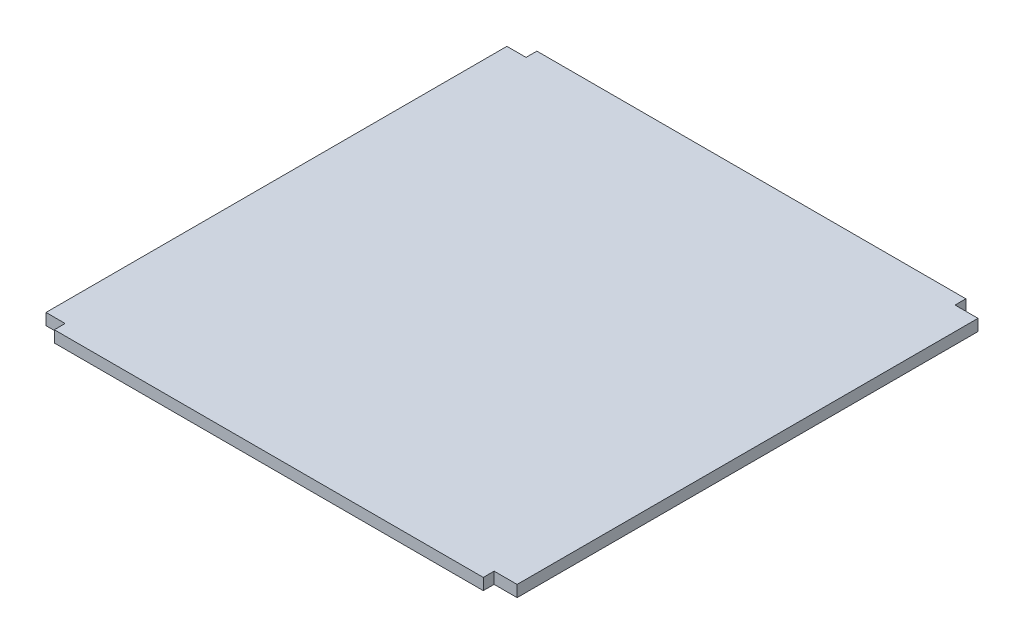
ISO-10303-21;
HEADER;
FILE_DESCRIPTION(('STEP AP214'),'2;1');
FILE_NAME('part.step','',(''),(''),'','','');
FILE_SCHEMA(('AUTOMOTIVE_DESIGN { 1 0 10303 214 1 1 1 1 }'));
ENDSEC;
DATA;
#1=APPLICATION_CONTEXT('core data for automotive mechanical design processes');
#2=APPLICATION_PROTOCOL_DEFINITION('international standard','automotive_design',2000,#1);
#3=PRODUCT_CONTEXT('',#1,'mechanical');
#4=PRODUCT('Part','Part','',(#3));
#5=PRODUCT_RELATED_PRODUCT_CATEGORY('part','',(#4));
#6=PRODUCT_DEFINITION_FORMATION('','',#4);
#7=PRODUCT_DEFINITION_CONTEXT('part definition',#1,'design');
#8=PRODUCT_DEFINITION('design','',#6,#7);
#9=PRODUCT_DEFINITION_SHAPE('','',#8);
#10=(LENGTH_UNIT() NAMED_UNIT(*) SI_UNIT(.MILLI.,.METRE.));
#11=(NAMED_UNIT(*) PLANE_ANGLE_UNIT() SI_UNIT($,.RADIAN.));
#12=(NAMED_UNIT(*) SI_UNIT($,.STERADIAN.) SOLID_ANGLE_UNIT());
#13=UNCERTAINTY_MEASURE_WITH_UNIT(LENGTH_MEASURE(1.E-05),#10,'distance_accuracy_value','');
#14=(GEOMETRIC_REPRESENTATION_CONTEXT(3) GLOBAL_UNCERTAINTY_ASSIGNED_CONTEXT((#13)) GLOBAL_UNIT_ASSIGNED_CONTEXT((#10,
#11,#12)) REPRESENTATION_CONTEXT('',''));
#15=CARTESIAN_POINT('',(0.,0.,0.));
#16=DIRECTION('',(0.,0.,1.));
#17=DIRECTION('',(1.,0.,0.));
#18=AXIS2_PLACEMENT_3D('',#15,#16,#17);
#19=CARTESIAN_POINT('',(2.5,1.5,-1.415));
#20=DIRECTION('',(0.,0.,-1.));
#21=DIRECTION('',(-1.,0.,0.));
#22=AXIS2_PLACEMENT_3D('',#19,#20,#21);
#23=PLANE('',#22);
#24=DIRECTION('',(1.,0.,0.));
#25=VECTOR('',#24,1.);
#26=CARTESIAN_POINT('',(2.5,0.,-1.415));
#27=LINE('',#26,#25);
#28=CARTESIAN_POINT('',(0.,0.,-1.415));
#29=VERTEX_POINT('',#28);
#30=CARTESIAN_POINT('',(2.5,0.,-1.415));
#31=VERTEX_POINT('',#30);
#32=EDGE_CURVE('E170',#29,#31,#27,.T.);
#33=ORIENTED_EDGE('',*,*,#32,.T.);
#34=DIRECTION('',(0.,-1.,0.));
#35=VECTOR('',#34,1.);
#36=CARTESIAN_POINT('',(2.5,1.5,-1.415));
#37=LINE('',#36,#35);
#38=CARTESIAN_POINT('',(2.5,1.5,-1.415));
#39=VERTEX_POINT('',#38);
#40=EDGE_CURVE('E11',#39,#31,#37,.T.);
#41=ORIENTED_EDGE('',*,*,#40,.F.);
#42=DIRECTION('',(1.,0.,0.));
#43=VECTOR('',#42,1.);
#44=CARTESIAN_POINT('',(2.5,1.5,-1.415));
#45=LINE('',#44,#43);
#46=CARTESIAN_POINT('',(0.,1.5,-1.415));
#47=VERTEX_POINT('',#46);
#48=EDGE_CURVE('E204',#47,#39,#45,.T.);
#49=ORIENTED_EDGE('',*,*,#48,.F.);
#50=DIRECTION('',(0.,-1.,0.));
#51=VECTOR('',#50,1.);
#52=CARTESIAN_POINT('',(0.,1.5,-1.415));
#53=LINE('',#52,#51);
#54=EDGE_CURVE('E166',#47,#29,#53,.T.);
#55=ORIENTED_EDGE('',*,*,#54,.T.);
#56=EDGE_LOOP('',(#33,#41,#49,#55));
#57=FACE_BOUND('',#56,.T.);
#58=ADVANCED_FACE('F45',(#57),#23,.F.);
#59=CARTESIAN_POINT('',(2.5,1.5,0.));
#60=DIRECTION('',(1.,0.,0.));
#61=DIRECTION('',(0.,0.,-1.));
#62=AXIS2_PLACEMENT_3D('',#59,#60,#61);
#63=PLANE('',#62);
#64=DIRECTION('',(0.,0.,1.));
#65=VECTOR('',#64,1.);
#66=CARTESIAN_POINT('',(2.5,0.,0.));
#67=LINE('',#66,#65);
#68=CARTESIAN_POINT('',(2.5,0.,0.));
#69=VERTEX_POINT('',#68);
#70=EDGE_CURVE('E174',#31,#69,#67,.T.);
#71=ORIENTED_EDGE('',*,*,#70,.T.);
#72=DIRECTION('',(0.,-1.,0.));
#73=VECTOR('',#72,1.);
#74=CARTESIAN_POINT('',(2.5,1.5,0.));
#75=LINE('',#74,#73);
#76=CARTESIAN_POINT('',(2.5,1.5,0.));
#77=VERTEX_POINT('',#76);
#78=EDGE_CURVE('E54',#77,#69,#75,.T.);
#79=ORIENTED_EDGE('',*,*,#78,.F.);
#80=DIRECTION('',(0.,0.,1.));
#81=VECTOR('',#80,1.);
#82=CARTESIAN_POINT('',(2.5,1.5,0.));
#83=LINE('',#82,#81);
#84=EDGE_CURVE('E117',#39,#77,#83,.T.);
#85=ORIENTED_EDGE('',*,*,#84,.F.);
#86=ORIENTED_EDGE('',*,*,#40,.T.);
#87=EDGE_LOOP('',(#71,#79,#85,#86));
#88=FACE_BOUND('',#87,.T.);
#89=ADVANCED_FACE('F298',(#88),#63,.F.);
#90=CARTESIAN_POINT('',(58.5,1.5,0.));
#91=DIRECTION('',(0.,0.,-1.));
#92=DIRECTION('',(-1.,0.,0.));
#93=AXIS2_PLACEMENT_3D('',#90,#91,#92);
#94=PLANE('',#93);
#95=DIRECTION('',(1.,0.,0.));
#96=VECTOR('',#95,1.);
#97=CARTESIAN_POINT('',(58.5,0.,0.));
#98=LINE('',#97,#96);
#99=CARTESIAN_POINT('',(58.5,0.,0.));
#100=VERTEX_POINT('',#99);
#101=EDGE_CURVE('E177',#69,#100,#98,.T.);
#102=ORIENTED_EDGE('',*,*,#101,.T.);
#103=DIRECTION('',(0.,-1.,0.));
#104=VECTOR('',#103,1.);
#105=CARTESIAN_POINT('',(58.5,1.5,0.));
#106=LINE('',#105,#104);
#107=CARTESIAN_POINT('',(58.5,1.5,0.));
#108=VERTEX_POINT('',#107);
#109=EDGE_CURVE('E231',#108,#100,#106,.T.);
#110=ORIENTED_EDGE('',*,*,#109,.F.);
#111=DIRECTION('',(1.,0.,0.));
#112=VECTOR('',#111,1.);
#113=CARTESIAN_POINT('',(58.5,1.5,0.));
#114=LINE('',#113,#112);
#115=EDGE_CURVE('E241',#77,#108,#114,.T.);
#116=ORIENTED_EDGE('',*,*,#115,.F.);
#117=ORIENTED_EDGE('',*,*,#78,.T.);
#118=EDGE_LOOP('',(#102,#110,#116,#117));
#119=FACE_BOUND('',#118,.T.);
#120=ADVANCED_FACE('F239',(#119),#94,.F.);
#121=CARTESIAN_POINT('',(58.5,1.5,-1.415));
#122=DIRECTION('',(-1.,0.,0.));
#123=DIRECTION('',(0.,0.,1.));
#124=AXIS2_PLACEMENT_3D('',#121,#122,#123);
#125=PLANE('',#124);
#126=DIRECTION('',(0.,0.,-1.));
#127=VECTOR('',#126,1.);
#128=CARTESIAN_POINT('',(58.5,0.,-1.415));
#129=LINE('',#128,#127);
#130=CARTESIAN_POINT('',(58.5,0.,-1.415));
#131=VERTEX_POINT('',#130);
#132=EDGE_CURVE('E180',#100,#131,#129,.T.);
#133=ORIENTED_EDGE('',*,*,#132,.T.);
#134=DIRECTION('',(0.,-1.,0.));
#135=VECTOR('',#134,1.);
#136=CARTESIAN_POINT('',(58.5,1.5,-1.415));
#137=LINE('',#136,#135);
#138=CARTESIAN_POINT('',(58.5,1.5,-1.415));
#139=VERTEX_POINT('',#138);
#140=EDGE_CURVE('E227',#139,#131,#137,.T.);
#141=ORIENTED_EDGE('',*,*,#140,.F.);
#142=DIRECTION('',(0.,0.,-1.));
#143=VECTOR('',#142,1.);
#144=CARTESIAN_POINT('',(58.5,1.5,-1.415));
#145=LINE('',#144,#143);
#146=EDGE_CURVE('E260',#108,#139,#145,.T.);
#147=ORIENTED_EDGE('',*,*,#146,.F.);
#148=ORIENTED_EDGE('',*,*,#109,.T.);
#149=EDGE_LOOP('',(#133,#141,#147,#148));
#150=FACE_BOUND('',#149,.T.);
#151=ADVANCED_FACE('F250',(#150),#125,.F.);
#152=CARTESIAN_POINT('',(61.5,1.5,-1.415));
#153=DIRECTION('',(0.,0.,-1.));
#154=DIRECTION('',(-1.,0.,0.));
#155=AXIS2_PLACEMENT_3D('',#152,#153,#154);
#156=PLANE('',#155);
#157=DIRECTION('',(1.,0.,0.));
#158=VECTOR('',#157,1.);
#159=CARTESIAN_POINT('',(61.5,0.,-1.415));
#160=LINE('',#159,#158);
#161=CARTESIAN_POINT('',(61.5,0.,-1.415));
#162=VERTEX_POINT('',#161);
#163=EDGE_CURVE('E183',#131,#162,#160,.T.);
#164=ORIENTED_EDGE('',*,*,#163,.T.);
#165=DIRECTION('',(0.,-1.,0.));
#166=VECTOR('',#165,1.);
#167=CARTESIAN_POINT('',(61.5,1.5,-1.415));
#168=LINE('',#167,#166);
#169=CARTESIAN_POINT('',(61.5,1.5,-1.415));
#170=VERTEX_POINT('',#169);
#171=EDGE_CURVE('E223',#170,#162,#168,.T.);
#172=ORIENTED_EDGE('',*,*,#171,.F.);
#173=DIRECTION('',(1.,0.,0.));
#174=VECTOR('',#173,1.);
#175=CARTESIAN_POINT('',(61.5,1.5,-1.415));
#176=LINE('',#175,#174);
#177=EDGE_CURVE('E256',#139,#170,#176,.T.);
#178=ORIENTED_EDGE('',*,*,#177,.F.);
#179=ORIENTED_EDGE('',*,*,#140,.T.);
#180=EDGE_LOOP('',(#164,#172,#178,#179));
#181=FACE_BOUND('',#180,.T.);
#182=ADVANCED_FACE('F254',(#181),#156,.F.);
#183=CARTESIAN_POINT('',(61.5,1.5,-61.585));
#184=DIRECTION('',(-1.,0.,0.));
#185=DIRECTION('',(0.,0.,1.));
#186=AXIS2_PLACEMENT_3D('',#183,#184,#185);
#187=PLANE('',#186);
#188=DIRECTION('',(0.,0.,-1.));
#189=VECTOR('',#188,1.);
#190=CARTESIAN_POINT('',(61.5,0.,-61.585));
#191=LINE('',#190,#189);
#192=CARTESIAN_POINT('',(61.5,0.,-61.585));
#193=VERTEX_POINT('',#192);
#194=EDGE_CURVE('E186',#162,#193,#191,.T.);
#195=ORIENTED_EDGE('',*,*,#194,.T.);
#196=DIRECTION('',(0.,-1.,0.));
#197=VECTOR('',#196,1.);
#198=CARTESIAN_POINT('',(61.5,1.5,-61.585));
#199=LINE('',#198,#197);
#200=CARTESIAN_POINT('',(61.5,1.5,-61.585));
#201=VERTEX_POINT('',#200);
#202=EDGE_CURVE('E219',#201,#193,#199,.T.);
#203=ORIENTED_EDGE('',*,*,#202,.F.);
#204=DIRECTION('',(0.,0.,-1.));
#205=VECTOR('',#204,1.);
#206=CARTESIAN_POINT('',(61.5,1.5,-61.585));
#207=LINE('',#206,#205);
#208=EDGE_CURVE('E259',#170,#201,#207,.T.);
#209=ORIENTED_EDGE('',*,*,#208,.F.);
#210=ORIENTED_EDGE('',*,*,#171,.T.);
#211=EDGE_LOOP('',(#195,#203,#209,#210));
#212=FACE_BOUND('',#211,.T.);
#213=ADVANCED_FACE('F311',(#212),#187,.F.);
#214=CARTESIAN_POINT('',(58.5,1.5,-61.585));
#215=DIRECTION('',(0.,0.,1.));
#216=DIRECTION('',(1.,0.,0.));
#217=AXIS2_PLACEMENT_3D('',#214,#215,#216);
#218=PLANE('',#217);
#219=DIRECTION('',(-1.,0.,0.));
#220=VECTOR('',#219,1.);
#221=CARTESIAN_POINT('',(58.5,0.,-61.585));
#222=LINE('',#221,#220);
#223=CARTESIAN_POINT('',(58.5,0.,-61.585));
#224=VERTEX_POINT('',#223);
#225=EDGE_CURVE('E189',#193,#224,#222,.T.);
#226=ORIENTED_EDGE('',*,*,#225,.T.);
#227=DIRECTION('',(0.,-1.,0.));
#228=VECTOR('',#227,1.);
#229=CARTESIAN_POINT('',(58.5,1.5,-61.585));
#230=LINE('',#229,#228);
#231=CARTESIAN_POINT('',(58.5,1.5,-61.585));
#232=VERTEX_POINT('',#231);
#233=EDGE_CURVE('E215',#232,#224,#230,.T.);
#234=ORIENTED_EDGE('',*,*,#233,.F.);
#235=DIRECTION('',(-1.,0.,0.));
#236=VECTOR('',#235,1.);
#237=CARTESIAN_POINT('',(58.5,1.5,-61.585));
#238=LINE('',#237,#236);
#239=EDGE_CURVE('E264',#201,#232,#238,.T.);
#240=ORIENTED_EDGE('',*,*,#239,.F.);
#241=ORIENTED_EDGE('',*,*,#202,.T.);
#242=EDGE_LOOP('',(#226,#234,#240,#241));
#243=FACE_BOUND('',#242,.T.);
#244=ADVANCED_FACE('F314',(#243),#218,.F.);
#245=CARTESIAN_POINT('',(58.5,1.5,-63.));
#246=DIRECTION('',(-1.,0.,0.));
#247=DIRECTION('',(0.,0.,1.));
#248=AXIS2_PLACEMENT_3D('',#245,#246,#247);
#249=PLANE('',#248);
#250=DIRECTION('',(0.,0.,-1.));
#251=VECTOR('',#250,1.);
#252=CARTESIAN_POINT('',(58.5,0.,-63.));
#253=LINE('',#252,#251);
#254=CARTESIAN_POINT('',(58.5,0.,-63.));
#255=VERTEX_POINT('',#254);
#256=EDGE_CURVE('E192',#224,#255,#253,.T.);
#257=ORIENTED_EDGE('',*,*,#256,.T.);
#258=DIRECTION('',(0.,-1.,0.));
#259=VECTOR('',#258,1.);
#260=CARTESIAN_POINT('',(58.5,1.5,-63.));
#261=LINE('',#260,#259);
#262=CARTESIAN_POINT('',(58.5,1.5,-63.));
#263=VERTEX_POINT('',#262);
#264=EDGE_CURVE('E211',#263,#255,#261,.T.);
#265=ORIENTED_EDGE('',*,*,#264,.F.);
#266=DIRECTION('',(0.,0.,-1.));
#267=VECTOR('',#266,1.);
#268=CARTESIAN_POINT('',(58.5,1.5,-63.));
#269=LINE('',#268,#267);
#270=EDGE_CURVE('E271',#232,#263,#269,.T.);
#271=ORIENTED_EDGE('',*,*,#270,.F.);
#272=ORIENTED_EDGE('',*,*,#233,.T.);
#273=EDGE_LOOP('',(#257,#265,#271,#272));
#274=FACE_BOUND('',#273,.T.);
#275=ADVANCED_FACE('F279',(#274),#249,.F.);
#276=CARTESIAN_POINT('',(2.5,1.5,-63.));
#277=DIRECTION('',(0.,0.,1.));
#278=DIRECTION('',(1.,0.,0.));
#279=AXIS2_PLACEMENT_3D('',#276,#277,#278);
#280=PLANE('',#279);
#281=DIRECTION('',(-1.,0.,0.));
#282=VECTOR('',#281,1.);
#283=CARTESIAN_POINT('',(2.5,0.,-63.));
#284=LINE('',#283,#282);
#285=CARTESIAN_POINT('',(2.5,0.,-63.));
#286=VERTEX_POINT('',#285);
#287=EDGE_CURVE('E195',#255,#286,#284,.T.);
#288=ORIENTED_EDGE('',*,*,#287,.T.);
#289=DIRECTION('',(0.,-1.,0.));
#290=VECTOR('',#289,1.);
#291=CARTESIAN_POINT('',(2.5,1.5,-63.));
#292=LINE('',#291,#290);
#293=CARTESIAN_POINT('',(2.5,1.5,-63.));
#294=VERTEX_POINT('',#293);
#295=EDGE_CURVE('E159',#294,#286,#292,.T.);
#296=ORIENTED_EDGE('',*,*,#295,.F.);
#297=DIRECTION('',(-1.,0.,0.));
#298=VECTOR('',#297,1.);
#299=CARTESIAN_POINT('',(2.5,1.5,-63.));
#300=LINE('',#299,#298);
#301=EDGE_CURVE('E148',#263,#294,#300,.T.);
#302=ORIENTED_EDGE('',*,*,#301,.F.);
#303=ORIENTED_EDGE('',*,*,#264,.T.);
#304=EDGE_LOOP('',(#288,#296,#302,#303));
#305=FACE_BOUND('',#304,.T.);
#306=ADVANCED_FACE('F283',(#305),#280,.F.);
#307=CARTESIAN_POINT('',(2.5,1.5,-61.585));
#308=DIRECTION('',(1.,0.,0.));
#309=DIRECTION('',(0.,0.,-1.));
#310=AXIS2_PLACEMENT_3D('',#307,#308,#309);
#311=PLANE('',#310);
#312=DIRECTION('',(0.,0.,1.));
#313=VECTOR('',#312,1.);
#314=CARTESIAN_POINT('',(2.5,0.,-61.585));
#315=LINE('',#314,#313);
#316=CARTESIAN_POINT('',(2.5,0.,-61.585));
#317=VERTEX_POINT('',#316);
#318=EDGE_CURVE('E157',#286,#317,#315,.T.);
#319=ORIENTED_EDGE('',*,*,#318,.T.);
#320=DIRECTION('',(0.,-1.,0.));
#321=VECTOR('',#320,1.);
#322=CARTESIAN_POINT('',(2.5,1.5,-61.585));
#323=LINE('',#322,#321);
#324=CARTESIAN_POINT('',(2.5,1.5,-61.585));
#325=VERTEX_POINT('',#324);
#326=EDGE_CURVE('E154',#325,#317,#323,.T.);
#327=ORIENTED_EDGE('',*,*,#326,.F.);
#328=DIRECTION('',(0.,0.,1.));
#329=VECTOR('',#328,1.);
#330=CARTESIAN_POINT('',(2.5,1.5,-61.585));
#331=LINE('',#330,#329);
#332=EDGE_CURVE('E142',#294,#325,#331,.T.);
#333=ORIENTED_EDGE('',*,*,#332,.F.);
#334=ORIENTED_EDGE('',*,*,#295,.T.);
#335=EDGE_LOOP('',(#319,#327,#333,#334));
#336=FACE_BOUND('',#335,.T.);
#337=ADVANCED_FACE('F155',(#336),#311,.F.);
#338=CARTESIAN_POINT('',(0.,1.5,-61.585));
#339=DIRECTION('',(0.,0.,1.));
#340=DIRECTION('',(1.,0.,0.));
#341=AXIS2_PLACEMENT_3D('',#338,#339,#340);
#342=PLANE('',#341);
#343=DIRECTION('',(-1.,0.,0.));
#344=VECTOR('',#343,1.);
#345=CARTESIAN_POINT('',(0.,0.,-61.585));
#346=LINE('',#345,#344);
#347=CARTESIAN_POINT('',(0.,0.,-61.585));
#348=VERTEX_POINT('',#347);
#349=EDGE_CURVE('E103',#317,#348,#346,.T.);
#350=ORIENTED_EDGE('',*,*,#349,.T.);
#351=DIRECTION('',(0.,-1.,0.));
#352=VECTOR('',#351,1.);
#353=CARTESIAN_POINT('',(0.,1.5,-61.585));
#354=LINE('',#353,#352);
#355=CARTESIAN_POINT('',(0.,1.5,-61.585));
#356=VERTEX_POINT('',#355);
#357=EDGE_CURVE('E160',#356,#348,#354,.T.);
#358=ORIENTED_EDGE('',*,*,#357,.F.);
#359=DIRECTION('',(-1.,0.,0.));
#360=VECTOR('',#359,1.);
#361=CARTESIAN_POINT('',(0.,1.5,-61.585));
#362=LINE('',#361,#360);
#363=EDGE_CURVE('E146',#325,#356,#362,.T.);
#364=ORIENTED_EDGE('',*,*,#363,.F.);
#365=ORIENTED_EDGE('',*,*,#326,.T.);
#366=EDGE_LOOP('',(#350,#358,#364,#365));
#367=FACE_BOUND('',#366,.T.);
#368=ADVANCED_FACE('F162',(#367),#342,.F.);
#369=CARTESIAN_POINT('',(0.,1.5,-1.415));
#370=DIRECTION('',(1.,0.,0.));
#371=DIRECTION('',(0.,0.,-1.));
#372=AXIS2_PLACEMENT_3D('',#369,#370,#371);
#373=PLANE('',#372);
#374=DIRECTION('',(0.,0.,1.));
#375=VECTOR('',#374,1.);
#376=CARTESIAN_POINT('',(0.,0.,-1.415));
#377=LINE('',#376,#375);
#378=EDGE_CURVE('E109',#348,#29,#377,.T.);
#379=ORIENTED_EDGE('',*,*,#378,.T.);
#380=ORIENTED_EDGE('',*,*,#54,.F.);
#381=DIRECTION('',(0.,0.,1.));
#382=VECTOR('',#381,1.);
#383=CARTESIAN_POINT('',(0.,1.5,-1.415));
#384=LINE('',#383,#382);
#385=EDGE_CURVE('E62',#356,#47,#384,.T.);
#386=ORIENTED_EDGE('',*,*,#385,.F.);
#387=ORIENTED_EDGE('',*,*,#357,.T.);
#388=EDGE_LOOP('',(#379,#380,#386,#387));
#389=FACE_BOUND('',#388,.T.);
#390=ADVANCED_FACE('F287',(#389),#373,.F.);
#391=CARTESIAN_POINT('',(0.,1.5,0.));
#392=DIRECTION('',(0.,-1.,0.));
#393=DIRECTION('',(0.,0.,-1.));
#394=AXIS2_PLACEMENT_3D('',#391,#392,#393);
#395=PLANE('',#394);
#396=ORIENTED_EDGE('',*,*,#48,.T.);
#397=ORIENTED_EDGE('',*,*,#84,.T.);
#398=ORIENTED_EDGE('',*,*,#115,.T.);
#399=ORIENTED_EDGE('',*,*,#146,.T.);
#400=ORIENTED_EDGE('',*,*,#177,.T.);
#401=ORIENTED_EDGE('',*,*,#208,.T.);
#402=ORIENTED_EDGE('',*,*,#239,.T.);
#403=ORIENTED_EDGE('',*,*,#270,.T.);
#404=ORIENTED_EDGE('',*,*,#301,.T.);
#405=ORIENTED_EDGE('',*,*,#332,.T.);
#406=ORIENTED_EDGE('',*,*,#363,.T.);
#407=ORIENTED_EDGE('',*,*,#385,.T.);
#408=EDGE_LOOP('',(#396,#397,#398,#399,#400,#401,#402,#403,#404,#405,#406,#407));
#409=FACE_BOUND('',#408,.T.);
#410=ADVANCED_FACE('F144',(#409),#395,.F.);
#411=CARTESIAN_POINT('',(0.,0.,0.));
#412=DIRECTION('',(0.,-1.,0.));
#413=DIRECTION('',(0.,0.,-1.));
#414=AXIS2_PLACEMENT_3D('',#411,#412,#413);
#415=PLANE('',#414);
#416=ORIENTED_EDGE('',*,*,#32,.F.);
#417=ORIENTED_EDGE('',*,*,#378,.F.);
#418=ORIENTED_EDGE('',*,*,#349,.F.);
#419=ORIENTED_EDGE('',*,*,#318,.F.);
#420=ORIENTED_EDGE('',*,*,#287,.F.);
#421=ORIENTED_EDGE('',*,*,#256,.F.);
#422=ORIENTED_EDGE('',*,*,#225,.F.);
#423=ORIENTED_EDGE('',*,*,#194,.F.);
#424=ORIENTED_EDGE('',*,*,#163,.F.);
#425=ORIENTED_EDGE('',*,*,#132,.F.);
#426=ORIENTED_EDGE('',*,*,#101,.F.);
#427=ORIENTED_EDGE('',*,*,#70,.F.);
#428=EDGE_LOOP('',(#416,#417,#418,#419,#420,#421,#422,#423,#424,#425,#426,#427));
#429=FACE_BOUND('',#428,.T.);
#430=ADVANCED_FACE('F245',(#429),#415,.T.);
#431=CLOSED_SHELL('',(#58,#89,#120,#151,#182,#213,#244,#275,#306,#337,#368,#390,#410,#430));
#432=MANIFOLD_SOLID_BREP('B2',#431);
#433=ADVANCED_BREP_SHAPE_REPRESENTATION('',(#18,#432),#14);
#434=SHAPE_DEFINITION_REPRESENTATION(#9,#433);
ENDSEC;
END-ISO-10303-21;
